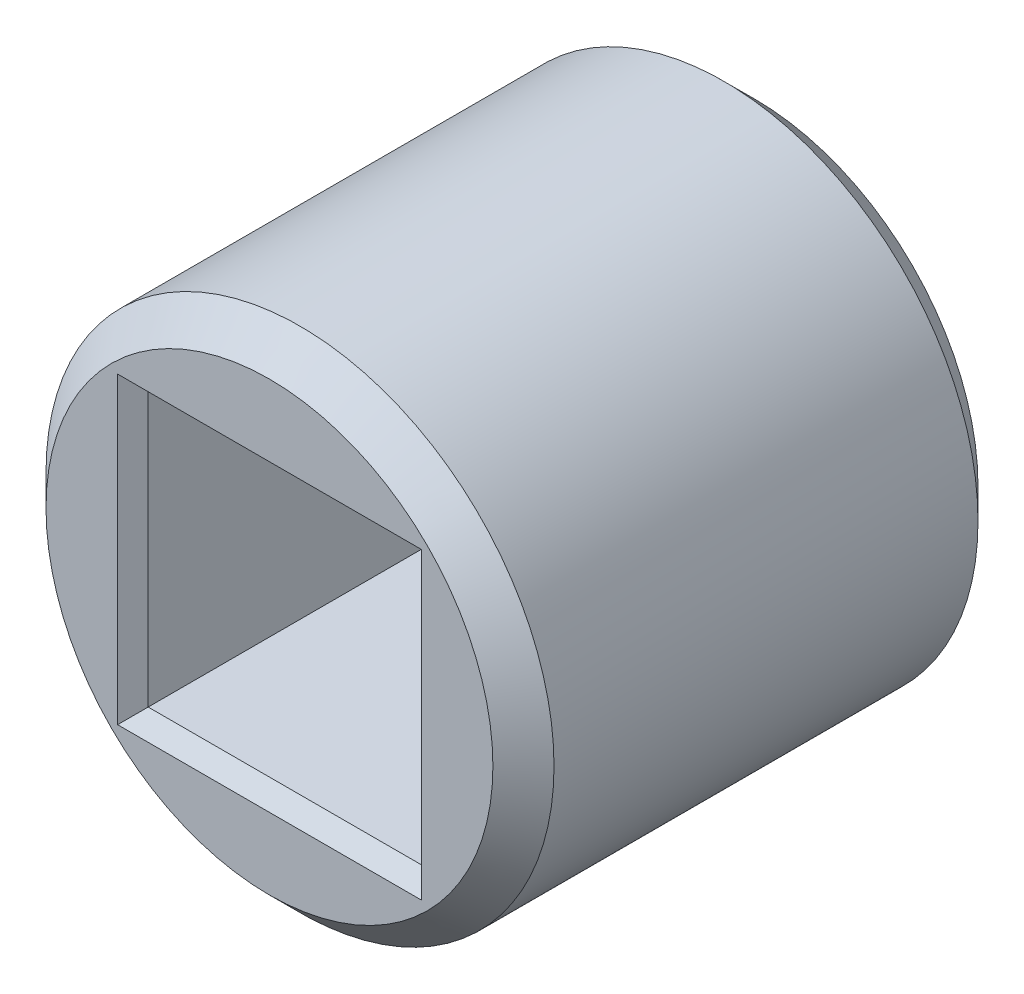
ISO-10303-21;
HEADER;
FILE_DESCRIPTION(('STEP AP214'),'2;1');
FILE_NAME('part.step','',(''),(''),'','','');
FILE_SCHEMA(('AUTOMOTIVE_DESIGN { 1 0 10303 214 1 1 1 1 }'));
ENDSEC;
DATA;
#1=APPLICATION_CONTEXT('core data for automotive mechanical design processes');
#2=APPLICATION_PROTOCOL_DEFINITION('international standard','automotive_design',2000,#1);
#3=PRODUCT_CONTEXT('',#1,'mechanical');
#4=PRODUCT('Part','Part','',(#3));
#5=PRODUCT_RELATED_PRODUCT_CATEGORY('part','',(#4));
#6=PRODUCT_DEFINITION_FORMATION('','',#4);
#7=PRODUCT_DEFINITION_CONTEXT('part definition',#1,'design');
#8=PRODUCT_DEFINITION('design','',#6,#7);
#9=PRODUCT_DEFINITION_SHAPE('','',#8);
#10=(LENGTH_UNIT() NAMED_UNIT(*) SI_UNIT(.MILLI.,.METRE.));
#11=(NAMED_UNIT(*) PLANE_ANGLE_UNIT() SI_UNIT($,.RADIAN.));
#12=(NAMED_UNIT(*) SI_UNIT($,.STERADIAN.) SOLID_ANGLE_UNIT());
#13=UNCERTAINTY_MEASURE_WITH_UNIT(LENGTH_MEASURE(1.E-05),#10,'distance_accuracy_value','');
#14=(GEOMETRIC_REPRESENTATION_CONTEXT(3) GLOBAL_UNCERTAINTY_ASSIGNED_CONTEXT((#13)) GLOBAL_UNIT_ASSIGNED_CONTEXT((#10,
#11,#12)) REPRESENTATION_CONTEXT('',''));
#15=CARTESIAN_POINT('',(0.,0.,0.));
#16=DIRECTION('',(0.,0.,1.));
#17=DIRECTION('',(1.,0.,0.));
#18=AXIS2_PLACEMENT_3D('',#15,#16,#17);
#19=CARTESIAN_POINT('',(0.,0.,6.35));
#20=DIRECTION('',(0.,0.,1.));
#21=DIRECTION('',(1.,0.,0.));
#22=AXIS2_PLACEMENT_3D('',#19,#20,#21);
#23=PLANE('',#22);
#24=DIRECTION('',(1.,0.,0.));
#25=VECTOR('',#24,1.);
#26=CARTESIAN_POINT('',(0.,1.9875,6.35));
#27=LINE('',#26,#25);
#28=CARTESIAN_POINT('',(-1.9875,1.9875,6.35));
#29=VERTEX_POINT('',#28);
#30=CARTESIAN_POINT('',(1.9875,1.9875,6.35));
#31=VERTEX_POINT('',#30);
#32=EDGE_CURVE('E42',#29,#31,#27,.T.);
#33=ORIENTED_EDGE('',*,*,#32,.T.);
#34=DIRECTION('',(0.,-1.,0.));
#35=VECTOR('',#34,1.);
#36=CARTESIAN_POINT('',(1.9875,0.,6.35));
#37=LINE('',#36,#35);
#38=CARTESIAN_POINT('',(1.9875,-1.9875,6.35));
#39=VERTEX_POINT('',#38);
#40=EDGE_CURVE('E11',#31,#39,#37,.T.);
#41=ORIENTED_EDGE('',*,*,#40,.T.);
#42=DIRECTION('',(-1.,0.,0.));
#43=VECTOR('',#42,1.);
#44=CARTESIAN_POINT('',(0.,-1.9875,6.35));
#45=LINE('',#44,#43);
#46=CARTESIAN_POINT('',(-1.9875,-1.9875,6.35));
#47=VERTEX_POINT('',#46);
#48=EDGE_CURVE('E149',#39,#47,#45,.T.);
#49=ORIENTED_EDGE('',*,*,#48,.T.);
#50=DIRECTION('',(0.,1.,0.));
#51=VECTOR('',#50,1.);
#52=CARTESIAN_POINT('',(-1.9875,0.,6.35));
#53=LINE('',#52,#51);
#54=EDGE_CURVE('E53',#47,#29,#53,.T.);
#55=ORIENTED_EDGE('',*,*,#54,.T.);
#56=EDGE_LOOP('',(#33,#41,#49,#55));
#57=FACE_BOUND('',#56,.T.);
#58=CARTESIAN_POINT('',(0.,0.,6.35));
#59=DIRECTION('',(0.,0.,1.));
#60=DIRECTION('',(1.,0.,0.));
#61=AXIS2_PLACEMENT_3D('',#58,#59,#60);
#62=CIRCLE('',#61,2.925);
#63=CARTESIAN_POINT('',(2.925,0.,6.35));
#64=VERTEX_POINT('',#63);
#65=EDGE_CURVE('E120',#64,#64,#62,.T.);
#66=ORIENTED_EDGE('',*,*,#65,.T.);
#67=EDGE_LOOP('',(#66));
#68=FACE_BOUND('',#67,.T.);
#69=ADVANCED_FACE('F33',(#57,#68),#23,.T.);
#70=CARTESIAN_POINT('',(0.,0.,0.));
#71=DIRECTION('',(0.,0.,1.));
#72=DIRECTION('',(1.,0.,0.));
#73=AXIS2_PLACEMENT_3D('',#70,#71,#72);
#74=PLANE('',#73);
#75=DIRECTION('',(0.,-1.,0.));
#76=VECTOR('',#75,1.);
#77=CARTESIAN_POINT('',(-1.9875,-1.7875,0.));
#78=LINE('',#77,#76);
#79=CARTESIAN_POINT('',(-1.9875,1.9875,0.));
#80=VERTEX_POINT('',#79);
#81=CARTESIAN_POINT('',(-1.9875,-1.9875,0.));
#82=VERTEX_POINT('',#81);
#83=EDGE_CURVE('E109',#80,#82,#78,.T.);
#84=ORIENTED_EDGE('',*,*,#83,.T.);
#85=DIRECTION('',(1.,0.,0.));
#86=VECTOR('',#85,1.);
#87=CARTESIAN_POINT('',(1.7875,-1.9875,0.));
#88=LINE('',#87,#86);
#89=CARTESIAN_POINT('',(1.9875,-1.9875,0.));
#90=VERTEX_POINT('',#89);
#91=EDGE_CURVE('E105',#82,#90,#88,.T.);
#92=ORIENTED_EDGE('',*,*,#91,.T.);
#93=DIRECTION('',(0.,1.,0.));
#94=VECTOR('',#93,1.);
#95=CARTESIAN_POINT('',(1.9875,1.7875,0.));
#96=LINE('',#95,#94);
#97=CARTESIAN_POINT('',(1.9875,1.9875,0.));
#98=VERTEX_POINT('',#97);
#99=EDGE_CURVE('E98',#90,#98,#96,.T.);
#100=ORIENTED_EDGE('',*,*,#99,.T.);
#101=DIRECTION('',(-1.,0.,0.));
#102=VECTOR('',#101,1.);
#103=CARTESIAN_POINT('',(-1.7875,1.9875,0.));
#104=LINE('',#103,#102);
#105=EDGE_CURVE('E102',#98,#80,#104,.T.);
#106=ORIENTED_EDGE('',*,*,#105,.T.);
#107=EDGE_LOOP('',(#84,#92,#100,#106));
#108=FACE_BOUND('',#107,.T.);
#109=CARTESIAN_POINT('',(0.,0.,0.));
#110=DIRECTION('',(0.,0.,1.));
#111=DIRECTION('',(1.,0.,0.));
#112=AXIS2_PLACEMENT_3D('',#109,#110,#111);
#113=CIRCLE('',#112,2.925);
#114=CARTESIAN_POINT('',(2.925,0.,0.));
#115=VERTEX_POINT('',#114);
#116=EDGE_CURVE('E172',#115,#115,#113,.F.);
#117=ORIENTED_EDGE('',*,*,#116,.T.);
#118=EDGE_LOOP('',(#117));
#119=FACE_BOUND('',#118,.T.);
#120=ADVANCED_FACE('F100',(#108,#119),#74,.F.);
#121=CARTESIAN_POINT('',(0.,0.,6.35));
#122=DIRECTION('',(0.,0.,-1.));
#123=DIRECTION('',(-1.,0.,0.));
#124=AXIS2_PLACEMENT_3D('',#121,#122,#123);
#125=CYLINDRICAL_SURFACE('',#124,3.325);
#126=CARTESIAN_POINT('',(0.,0.,0.399999999999998));
#127=DIRECTION('',(0.,0.,1.));
#128=DIRECTION('',(1.,0.,0.));
#129=AXIS2_PLACEMENT_3D('',#126,#127,#128);
#130=CIRCLE('',#129,3.325);
#131=CARTESIAN_POINT('',(3.325,0.,0.399999999999998));
#132=VERTEX_POINT('',#131);
#133=EDGE_CURVE('E175',#132,#132,#130,.T.);
#134=ORIENTED_EDGE('',*,*,#133,.T.);
#135=EDGE_LOOP('',(#134));
#136=FACE_BOUND('',#135,.T.);
#137=CARTESIAN_POINT('',(0.,0.,5.95));
#138=DIRECTION('',(0.,0.,1.));
#139=DIRECTION('',(1.,0.,0.));
#140=AXIS2_PLACEMENT_3D('',#137,#138,#139);
#141=CIRCLE('',#140,3.325);
#142=CARTESIAN_POINT('',(3.325,0.,5.95));
#143=VERTEX_POINT('',#142);
#144=EDGE_CURVE('E178',#143,#143,#141,.F.);
#145=ORIENTED_EDGE('',*,*,#144,.T.);
#146=EDGE_LOOP('',(#145));
#147=FACE_BOUND('',#146,.T.);
#148=ADVANCED_FACE('F229',(#136,#147),#125,.T.);
#149=CARTESIAN_POINT('',(1.7875,-1.7875,6.35));
#150=DIRECTION('',(-1.,0.,0.));
#151=DIRECTION('',(0.,0.,1.));
#152=AXIS2_PLACEMENT_3D('',#149,#150,#151);
#153=PLANE('',#152);
#154=DIRECTION('',(0.,0.,-1.));
#155=VECTOR('',#154,1.);
#156=CARTESIAN_POINT('',(1.7875,1.7875,6.35));
#157=LINE('',#156,#155);
#158=CARTESIAN_POINT('',(1.7875,1.7875,6.15));
#159=VERTEX_POINT('',#158);
#160=CARTESIAN_POINT('',(1.7875,1.7875,0.200000000000001));
#161=VERTEX_POINT('',#160);
#162=EDGE_CURVE('E181',#159,#161,#157,.T.);
#163=ORIENTED_EDGE('',*,*,#162,.T.);
#164=DIRECTION('',(0.,-1.,0.));
#165=VECTOR('',#164,1.);
#166=CARTESIAN_POINT('',(1.7875,-1.7875,0.200000000000001));
#167=LINE('',#166,#165);
#168=CARTESIAN_POINT('',(1.7875,-1.7875,0.200000000000001));
#169=VERTEX_POINT('',#168);
#170=EDGE_CURVE('E123',#161,#169,#167,.T.);
#171=ORIENTED_EDGE('',*,*,#170,.T.);
#172=DIRECTION('',(0.,0.,-1.));
#173=VECTOR('',#172,1.);
#174=CARTESIAN_POINT('',(1.7875,-1.7875,6.35));
#175=LINE('',#174,#173);
#176=CARTESIAN_POINT('',(1.7875,-1.7875,6.15));
#177=VERTEX_POINT('',#176);
#178=EDGE_CURVE('E126',#177,#169,#175,.T.);
#179=ORIENTED_EDGE('',*,*,#178,.F.);
#180=DIRECTION('',(0.,1.,0.));
#181=VECTOR('',#180,1.);
#182=CARTESIAN_POINT('',(1.7875,-1.7875,6.15));
#183=LINE('',#182,#181);
#184=EDGE_CURVE('E160',#177,#159,#183,.T.);
#185=ORIENTED_EDGE('',*,*,#184,.T.);
#186=EDGE_LOOP('',(#163,#171,#179,#185));
#187=FACE_BOUND('',#186,.T.);
#188=ADVANCED_FACE('F212',(#187),#153,.T.);
#189=CARTESIAN_POINT('',(-1.7875,1.7875,6.35));
#190=DIRECTION('',(0.,-1.,0.));
#191=DIRECTION('',(0.,0.,-1.));
#192=AXIS2_PLACEMENT_3D('',#189,#190,#191);
#193=PLANE('',#192);
#194=DIRECTION('',(0.,0.,-1.));
#195=VECTOR('',#194,1.);
#196=CARTESIAN_POINT('',(-1.7875,1.7875,6.35));
#197=LINE('',#196,#195);
#198=CARTESIAN_POINT('',(-1.7875,1.7875,6.15));
#199=VERTEX_POINT('',#198);
#200=CARTESIAN_POINT('',(-1.7875,1.7875,0.200000000000001));
#201=VERTEX_POINT('',#200);
#202=EDGE_CURVE('E184',#199,#201,#197,.T.);
#203=ORIENTED_EDGE('',*,*,#202,.T.);
#204=DIRECTION('',(1.,0.,0.));
#205=VECTOR('',#204,1.);
#206=CARTESIAN_POINT('',(1.7875,1.7875,0.200000000000001));
#207=LINE('',#206,#205);
#208=EDGE_CURVE('E151',#201,#161,#207,.T.);
#209=ORIENTED_EDGE('',*,*,#208,.T.);
#210=ORIENTED_EDGE('',*,*,#162,.F.);
#211=DIRECTION('',(-1.,0.,0.));
#212=VECTOR('',#211,1.);
#213=CARTESIAN_POINT('',(-1.7875,1.7875,6.15));
#214=LINE('',#213,#212);
#215=EDGE_CURVE('E153',#159,#199,#214,.T.);
#216=ORIENTED_EDGE('',*,*,#215,.T.);
#217=EDGE_LOOP('',(#203,#209,#210,#216));
#218=FACE_BOUND('',#217,.T.);
#219=ADVANCED_FACE('F207',(#218),#193,.T.);
#220=CARTESIAN_POINT('',(-1.7875,-1.7875,6.35));
#221=DIRECTION('',(1.,0.,0.));
#222=DIRECTION('',(0.,0.,-1.));
#223=AXIS2_PLACEMENT_3D('',#220,#221,#222);
#224=PLANE('',#223);
#225=DIRECTION('',(0.,0.,-1.));
#226=VECTOR('',#225,1.);
#227=CARTESIAN_POINT('',(-1.7875,-1.7875,6.35));
#228=LINE('',#227,#226);
#229=CARTESIAN_POINT('',(-1.7875,-1.7875,6.15));
#230=VERTEX_POINT('',#229);
#231=CARTESIAN_POINT('',(-1.7875,-1.7875,0.200000000000001));
#232=VERTEX_POINT('',#231);
#233=EDGE_CURVE('E187',#230,#232,#228,.T.);
#234=ORIENTED_EDGE('',*,*,#233,.T.);
#235=DIRECTION('',(0.,1.,0.));
#236=VECTOR('',#235,1.);
#237=CARTESIAN_POINT('',(-1.7875,1.7875,0.200000000000001));
#238=LINE('',#237,#236);
#239=EDGE_CURVE('E155',#232,#201,#238,.T.);
#240=ORIENTED_EDGE('',*,*,#239,.T.);
#241=ORIENTED_EDGE('',*,*,#202,.F.);
#242=DIRECTION('',(0.,-1.,0.));
#243=VECTOR('',#242,1.);
#244=CARTESIAN_POINT('',(-1.7875,-1.7875,6.15));
#245=LINE('',#244,#243);
#246=EDGE_CURVE('E157',#199,#230,#245,.T.);
#247=ORIENTED_EDGE('',*,*,#246,.T.);
#248=EDGE_LOOP('',(#234,#240,#241,#247));
#249=FACE_BOUND('',#248,.T.);
#250=ADVANCED_FACE('F204',(#249),#224,.T.);
#251=CARTESIAN_POINT('',(-1.7875,-1.7875,6.35));
#252=DIRECTION('',(0.,1.,0.));
#253=DIRECTION('',(0.,0.,1.));
#254=AXIS2_PLACEMENT_3D('',#251,#252,#253);
#255=PLANE('',#254);
#256=ORIENTED_EDGE('',*,*,#178,.T.);
#257=DIRECTION('',(-1.,0.,0.));
#258=VECTOR('',#257,1.);
#259=CARTESIAN_POINT('',(-1.7875,-1.7875,0.200000000000001));
#260=LINE('',#259,#258);
#261=EDGE_CURVE('E163',#169,#232,#260,.T.);
#262=ORIENTED_EDGE('',*,*,#261,.T.);
#263=ORIENTED_EDGE('',*,*,#233,.F.);
#264=DIRECTION('',(1.,0.,0.));
#265=VECTOR('',#264,1.);
#266=CARTESIAN_POINT('',(-1.7875,-1.7875,6.15));
#267=LINE('',#266,#265);
#268=EDGE_CURVE('E166',#230,#177,#267,.T.);
#269=ORIENTED_EDGE('',*,*,#268,.T.);
#270=EDGE_LOOP('',(#256,#262,#263,#269));
#271=FACE_BOUND('',#270,.T.);
#272=ADVANCED_FACE('F193',(#271),#255,.T.);
#273=CARTESIAN_POINT('',(0.,0.,0.399999999999998));
#274=DIRECTION('',(0.,0.,1.));
#275=DIRECTION('',(1.,0.,0.));
#276=AXIS2_PLACEMENT_3D('',#273,#274,#275);
#277=CONICAL_SURFACE('',#276,3.325,0.785398163397451);
#278=CARTESIAN_POINT('',(2.925,0.,0.));
#279=CARTESIAN_POINT('',(2.92916666666667,0.,0.00416666666666662));
#280=CARTESIAN_POINT('',(2.93333333333333,0.,0.00833333333333327));
#281=CARTESIAN_POINT('',(2.94166666666667,0.,0.0166666666666666));
#282=CARTESIAN_POINT('',(2.94583333333333,0.,0.0208333333333332));
#283=CARTESIAN_POINT('',(2.95416666666667,0.,0.0291666666666665));
#284=CARTESIAN_POINT('',(2.95833333333333,0.,0.0333333333333332));
#285=CARTESIAN_POINT('',(2.96666666666667,0.,0.0416666666666665));
#286=CARTESIAN_POINT('',(2.97083333333333,0.,0.0458333333333331));
#287=CARTESIAN_POINT('',(2.97916666666667,0.,0.0541666666666664));
#288=CARTESIAN_POINT('',(2.98333333333333,0.,0.058333333333333));
#289=CARTESIAN_POINT('',(2.99166666666667,0.,0.0666666666666663));
#290=CARTESIAN_POINT('',(2.99583333333333,0.,0.070833333333333));
#291=CARTESIAN_POINT('',(3.00416666666667,0.,0.0791666666666663));
#292=CARTESIAN_POINT('',(3.00833333333333,0.,0.083333333333333));
#293=CARTESIAN_POINT('',(3.01666666666667,0.,0.0916666666666663));
#294=CARTESIAN_POINT('',(3.02083333333333,0.,0.095833333333333));
#295=CARTESIAN_POINT('',(3.02916666666667,0.,0.104166666666666));
#296=CARTESIAN_POINT('',(3.03333333333333,0.,0.108333333333333));
#297=CARTESIAN_POINT('',(3.04166666666667,0.,0.116666666666666));
#298=CARTESIAN_POINT('',(3.04583333333333,0.,0.120833333333333));
#299=CARTESIAN_POINT('',(3.05416666666667,0.,0.129166666666666));
#300=CARTESIAN_POINT('',(3.05833333333333,0.,0.133333333333333));
#301=CARTESIAN_POINT('',(3.06666666666667,0.,0.141666666666666));
#302=CARTESIAN_POINT('',(3.07083333333333,0.,0.145833333333333));
#303=CARTESIAN_POINT('',(3.07916666666667,0.,0.154166666666666));
#304=CARTESIAN_POINT('',(3.08333333333333,0.,0.158333333333333));
#305=CARTESIAN_POINT('',(3.09166666666667,0.,0.166666666666666));
#306=CARTESIAN_POINT('',(3.09583333333333,0.,0.170833333333333));
#307=CARTESIAN_POINT('',(3.10416666666667,0.,0.179166666666666));
#308=CARTESIAN_POINT('',(3.10833333333333,0.,0.183333333333333));
#309=CARTESIAN_POINT('',(3.11666666666667,0.,0.191666666666666));
#310=CARTESIAN_POINT('',(3.12083333333333,0.,0.195833333333332));
#311=CARTESIAN_POINT('',(3.12916666666667,0.,0.204166666666666));
#312=CARTESIAN_POINT('',(3.13333333333333,0.,0.208333333333333));
#313=CARTESIAN_POINT('',(3.14166666666667,0.,0.216666666666666));
#314=CARTESIAN_POINT('',(3.14583333333333,0.,0.220833333333332));
#315=CARTESIAN_POINT('',(3.15416666666667,0.,0.229166666666666));
#316=CARTESIAN_POINT('',(3.15833333333333,0.,0.233333333333332));
#317=CARTESIAN_POINT('',(3.16666666666667,0.,0.241666666666666));
#318=CARTESIAN_POINT('',(3.17083333333333,0.,0.245833333333332));
#319=CARTESIAN_POINT('',(3.17916666666667,0.,0.254166666666666));
#320=CARTESIAN_POINT('',(3.18333333333333,0.,0.258333333333332));
#321=CARTESIAN_POINT('',(3.19166666666667,0.,0.266666666666666));
#322=CARTESIAN_POINT('',(3.19583333333333,0.,0.270833333333332));
#323=CARTESIAN_POINT('',(3.20416666666667,0.,0.279166666666665));
#324=CARTESIAN_POINT('',(3.20833333333333,0.,0.283333333333332));
#325=CARTESIAN_POINT('',(3.21666666666667,0.,0.291666666666665));
#326=CARTESIAN_POINT('',(3.22083333333333,0.,0.295833333333332));
#327=CARTESIAN_POINT('',(3.22916666666667,0.,0.304166666666665));
#328=CARTESIAN_POINT('',(3.23333333333333,0.,0.308333333333332));
#329=CARTESIAN_POINT('',(3.24166666666667,0.,0.316666666666665));
#330=CARTESIAN_POINT('',(3.24583333333333,0.,0.320833333333332));
#331=CARTESIAN_POINT('',(3.25416666666667,0.,0.329166666666665));
#332=CARTESIAN_POINT('',(3.25833333333333,0.,0.333333333333332));
#333=CARTESIAN_POINT('',(3.26666666666667,0.,0.341666666666665));
#334=CARTESIAN_POINT('',(3.27083333333333,0.,0.345833333333332));
#335=CARTESIAN_POINT('',(3.27916666666667,0.,0.354166666666665));
#336=CARTESIAN_POINT('',(3.28333333333333,0.,0.358333333333332));
#337=CARTESIAN_POINT('',(3.29166666666667,0.,0.366666666666665));
#338=CARTESIAN_POINT('',(3.29583333333333,0.,0.370833333333332));
#339=CARTESIAN_POINT('',(3.30416666666667,0.,0.379166666666665));
#340=CARTESIAN_POINT('',(3.30833333333333,0.,0.383333333333332));
#341=CARTESIAN_POINT('',(3.31666666666667,0.,0.391666666666665));
#342=CARTESIAN_POINT('',(3.32083333333333,0.,0.395833333333332));
#343=CARTESIAN_POINT('',(3.325,0.,0.399999999999998));
#344=B_SPLINE_CURVE_WITH_KNOTS('',3,(#278,#279,#280,#281,#282,#283,#284,#285,#286,#287,#288,
#289,#290,#291,#292,#293,#294,#295,#296,#297,#298,#299,#300,#301,#302,#303,#304,#305,#306,#307,
#308,#309,#310,#311,#312,#313,#314,#315,#316,#317,#318,#319,#320,#321,#322,#323,#324,#325,#326,
#327,#328,#329,#330,#331,#332,#333,#334,#335,#336,#337,#338,#339,#340,#341,#342,#343),
.UNSPECIFIED.,.F.,.F.,(4,2,2,2,2,2,2,2,2,2,2,2,2,2,2,2,2,2,2,2,2,2,2,2,2,2,2,2,2,2,2,2,4),(0.,
0.0176776695296636,0.0353553390593272,0.0530330085889908,0.0707106781186544,0.0883883476483183,
0.106066017177982,0.123743686707646,0.141421356237309,0.159099025766973,0.176776695296637,
0.1944543648263,0.212132034355964,0.229809703885628,0.247487373415291,0.265165042944955,
0.282842712474619,0.300520382004282,0.318198051533946,0.33587572106361,0.353553390593273,
0.371231060122937,0.388908729652601,0.406586399182264,0.424264068711928,0.441941738241592,
0.459619407771256,0.477297077300919,0.494974746830583,0.512652416360246,0.53033008588991,
0.548007755419574,0.565685424949237),.UNSPECIFIED.);
#345=EDGE_CURVE('BSEAM237',#115,#132,#344,.T.);
#346=ORIENTED_EDGE('',*,*,#116,.F.);
#347=ORIENTED_EDGE('',*,*,#133,.F.);
#348=ORIENTED_EDGE('',*,*,#345,.T.);
#349=ORIENTED_EDGE('',*,*,#345,.F.);
#350=EDGE_LOOP('',(#346,#348,#347,#349));
#351=FACE_BOUND('',#350,.T.);
#352=ADVANCED_FACE('F237',(#351),#277,.T.);
#353=CARTESIAN_POINT('',(0.,0.,6.35));
#354=DIRECTION('',(0.,0.,-1.));
#355=DIRECTION('',(-1.,0.,0.));
#356=AXIS2_PLACEMENT_3D('',#353,#354,#355);
#357=CONICAL_SURFACE('',#356,2.925,0.785398163397448);
#358=ORIENTED_EDGE('',*,*,#144,.F.);
#359=EDGE_LOOP('',(#358));
#360=FACE_BOUND('',#359,.T.);
#361=ORIENTED_EDGE('',*,*,#65,.F.);
#362=EDGE_LOOP('',(#361));
#363=FACE_BOUND('',#362,.T.);
#364=ADVANCED_FACE('F240',(#360,#363),#357,.T.);
#365=CARTESIAN_POINT('',(0.,1.9875,0.));
#366=DIRECTION('',(0.,-0.707106781186547,-0.707106781186547));
#367=DIRECTION('',(1.,0.,0.));
#368=AXIS2_PLACEMENT_3D('',#365,#366,#367);
#369=PLANE('',#368);
#370=DIRECTION('',(-0.577350269189625,-0.577350269189626,0.577350269189626));
#371=VECTOR('',#370,1.);
#372=CARTESIAN_POINT('',(1.325,1.325,0.662500000000001));
#373=LINE('',#372,#371);
#374=EDGE_CURVE('E115',#161,#98,#373,.F.);
#375=ORIENTED_EDGE('',*,*,#374,.F.);
#376=ORIENTED_EDGE('',*,*,#208,.F.);
#377=DIRECTION('',(-0.577350269189626,0.577350269189626,-0.577350269189626));
#378=VECTOR('',#377,1.);
#379=CARTESIAN_POINT('',(-1.325,1.325,0.6625));
#380=LINE('',#379,#378);
#381=EDGE_CURVE('E118',#80,#201,#380,.F.);
#382=ORIENTED_EDGE('',*,*,#381,.F.);
#383=ORIENTED_EDGE('',*,*,#105,.F.);
#384=EDGE_LOOP('',(#375,#376,#382,#383));
#385=FACE_BOUND('',#384,.T.);
#386=ADVANCED_FACE('F113',(#385),#369,.T.);
#387=CARTESIAN_POINT('',(-1.9875,0.,0.));
#388=DIRECTION('',(0.707106781186547,0.,-0.707106781186548));
#389=DIRECTION('',(0.,1.,0.));
#390=AXIS2_PLACEMENT_3D('',#387,#388,#389);
#391=PLANE('',#390);
#392=ORIENTED_EDGE('',*,*,#381,.T.);
#393=ORIENTED_EDGE('',*,*,#239,.F.);
#394=DIRECTION('',(-0.577350269189626,-0.577350269189626,-0.577350269189626));
#395=VECTOR('',#394,1.);
#396=CARTESIAN_POINT('',(-1.325,-1.325,0.6625));
#397=LINE('',#396,#395);
#398=EDGE_CURVE('E124',#82,#232,#397,.F.);
#399=ORIENTED_EDGE('',*,*,#398,.F.);
#400=ORIENTED_EDGE('',*,*,#83,.F.);
#401=EDGE_LOOP('',(#392,#393,#399,#400));
#402=FACE_BOUND('',#401,.T.);
#403=ADVANCED_FACE('F201',(#402),#391,.T.);
#404=CARTESIAN_POINT('',(1.9875,0.,0.));
#405=DIRECTION('',(-0.707106781186548,0.,-0.707106781186547));
#406=DIRECTION('',(0.,-1.,0.));
#407=AXIS2_PLACEMENT_3D('',#404,#405,#406);
#408=PLANE('',#407);
#409=ORIENTED_EDGE('',*,*,#374,.T.);
#410=ORIENTED_EDGE('',*,*,#99,.F.);
#411=DIRECTION('',(-0.577350269189625,0.577350269189626,0.577350269189626));
#412=VECTOR('',#411,1.);
#413=CARTESIAN_POINT('',(1.325,-1.325,0.6625));
#414=LINE('',#413,#412);
#415=EDGE_CURVE('E128',#169,#90,#414,.F.);
#416=ORIENTED_EDGE('',*,*,#415,.F.);
#417=ORIENTED_EDGE('',*,*,#170,.F.);
#418=EDGE_LOOP('',(#409,#410,#416,#417));
#419=FACE_BOUND('',#418,.T.);
#420=ADVANCED_FACE('F122',(#419),#408,.T.);
#421=CARTESIAN_POINT('',(0.,-1.9875,0.));
#422=DIRECTION('',(0.,0.707106781186547,-0.707106781186547));
#423=DIRECTION('',(-1.,0.,0.));
#424=AXIS2_PLACEMENT_3D('',#421,#422,#423);
#425=PLANE('',#424);
#426=ORIENTED_EDGE('',*,*,#398,.T.);
#427=ORIENTED_EDGE('',*,*,#261,.F.);
#428=ORIENTED_EDGE('',*,*,#415,.T.);
#429=ORIENTED_EDGE('',*,*,#91,.F.);
#430=EDGE_LOOP('',(#426,#427,#428,#429));
#431=FACE_BOUND('',#430,.T.);
#432=ADVANCED_FACE('F197',(#431),#425,.T.);
#433=CARTESIAN_POINT('',(-1.7875,-1.7875,6.15));
#434=DIRECTION('',(-0.707106781186547,0.,-0.707106781186548));
#435=DIRECTION('',(0.,-1.,0.));
#436=AXIS2_PLACEMENT_3D('',#433,#434,#435);
#437=PLANE('',#436);
#438=DIRECTION('',(-0.577350269189626,0.577350269189626,0.577350269189626));
#439=VECTOR('',#438,1.);
#440=CARTESIAN_POINT('',(-1.7875,1.7875,6.15));
#441=LINE('',#440,#439);
#442=EDGE_CURVE('E135',#29,#199,#441,.F.);
#443=ORIENTED_EDGE('',*,*,#442,.F.);
#444=ORIENTED_EDGE('',*,*,#54,.F.);
#445=DIRECTION('',(-0.577350269189626,-0.577350269189626,0.577350269189626));
#446=VECTOR('',#445,1.);
#447=CARTESIAN_POINT('',(-1.7875,-1.7875,6.15));
#448=LINE('',#447,#446);
#449=EDGE_CURVE('E37',#230,#47,#448,.T.);
#450=ORIENTED_EDGE('',*,*,#449,.F.);
#451=ORIENTED_EDGE('',*,*,#246,.F.);
#452=EDGE_LOOP('',(#443,#444,#450,#451));
#453=FACE_BOUND('',#452,.T.);
#454=ADVANCED_FACE('F35',(#453),#437,.F.);
#455=CARTESIAN_POINT('',(-1.7875,-1.7875,6.15));
#456=DIRECTION('',(0.,-0.707106781186548,-0.707106781186548));
#457=DIRECTION('',(1.,0.,0.));
#458=AXIS2_PLACEMENT_3D('',#455,#456,#457);
#459=PLANE('',#458);
#460=ORIENTED_EDGE('',*,*,#449,.T.);
#461=ORIENTED_EDGE('',*,*,#48,.F.);
#462=DIRECTION('',(-0.577350269189625,0.577350269189626,-0.577350269189626));
#463=VECTOR('',#462,1.);
#464=CARTESIAN_POINT('',(1.7875,-1.7875,6.15));
#465=LINE('',#464,#463);
#466=EDGE_CURVE('E134',#177,#39,#465,.F.);
#467=ORIENTED_EDGE('',*,*,#466,.F.);
#468=ORIENTED_EDGE('',*,*,#268,.F.);
#469=EDGE_LOOP('',(#460,#461,#467,#468));
#470=FACE_BOUND('',#469,.T.);
#471=ADVANCED_FACE('F217',(#470),#459,.F.);
#472=CARTESIAN_POINT('',(-1.7875,1.7875,6.15));
#473=DIRECTION('',(0.,0.707106781186548,-0.707106781186548));
#474=DIRECTION('',(-1.,0.,0.));
#475=AXIS2_PLACEMENT_3D('',#472,#473,#474);
#476=PLANE('',#475);
#477=ORIENTED_EDGE('',*,*,#442,.T.);
#478=ORIENTED_EDGE('',*,*,#215,.F.);
#479=DIRECTION('',(0.577350269189625,0.577350269189626,0.577350269189626));
#480=VECTOR('',#479,1.);
#481=CARTESIAN_POINT('',(0.595833333333334,0.595833333333333,4.95833333333333));
#482=LINE('',#481,#480);
#483=EDGE_CURVE('E132',#31,#159,#482,.F.);
#484=ORIENTED_EDGE('',*,*,#483,.F.);
#485=ORIENTED_EDGE('',*,*,#32,.F.);
#486=EDGE_LOOP('',(#477,#478,#484,#485));
#487=FACE_BOUND('',#486,.T.);
#488=ADVANCED_FACE('F210',(#487),#476,.F.);
#489=CARTESIAN_POINT('',(1.7875,-1.7875,6.15));
#490=DIRECTION('',(0.707106781186548,0.,-0.707106781186547));
#491=DIRECTION('',(0.,1.,0.));
#492=AXIS2_PLACEMENT_3D('',#489,#490,#491);
#493=PLANE('',#492);
#494=ORIENTED_EDGE('',*,*,#466,.T.);
#495=ORIENTED_EDGE('',*,*,#40,.F.);
#496=ORIENTED_EDGE('',*,*,#483,.T.);
#497=ORIENTED_EDGE('',*,*,#184,.F.);
#498=EDGE_LOOP('',(#494,#495,#496,#497));
#499=FACE_BOUND('',#498,.T.);
#500=ADVANCED_FACE('F214',(#499),#493,.F.);
#501=CLOSED_SHELL('',(#69,#120,#148,#188,#219,#250,#272,#352,#364,#386,#403,#420,#432,#454,#471,
#488,#500));
#502=MANIFOLD_SOLID_BREP('B2',#501);
#503=ADVANCED_BREP_SHAPE_REPRESENTATION('',(#18,#502),#14);
#504=SHAPE_DEFINITION_REPRESENTATION(#9,#503);
ENDSEC;
END-ISO-10303-21;
